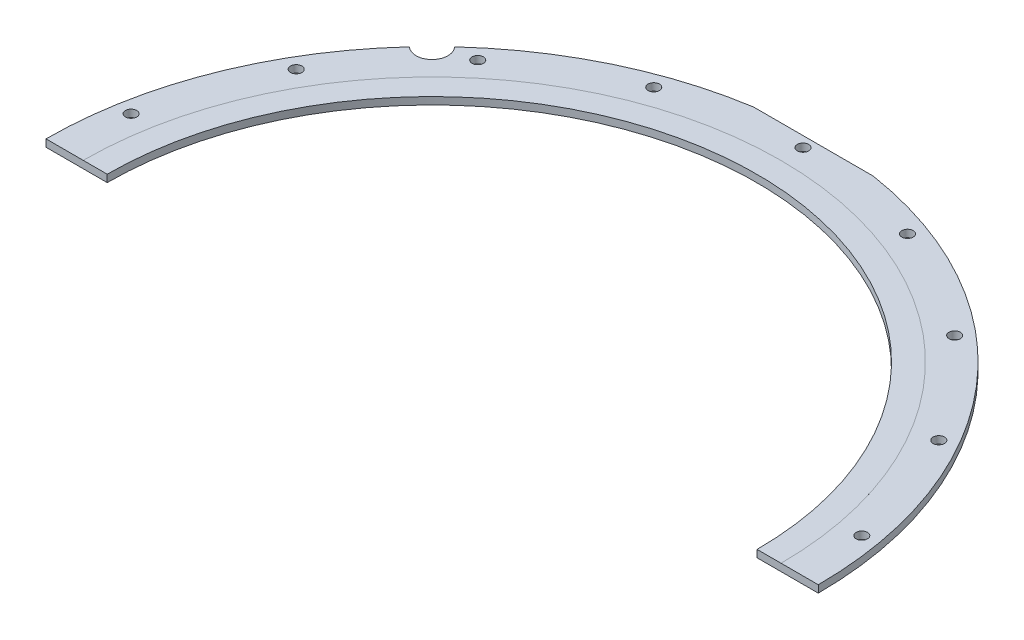
ISO-10303-21;
HEADER;
FILE_DESCRIPTION(('STEP AP214'),'2;1');
FILE_NAME('part.step','',(''),(''),'','','');
FILE_SCHEMA(('AUTOMOTIVE_DESIGN { 1 0 10303 214 1 1 1 1 }'));
ENDSEC;
DATA;
#1=APPLICATION_CONTEXT('core data for automotive mechanical design processes');
#2=APPLICATION_PROTOCOL_DEFINITION('international standard','automotive_design',2000,#1);
#3=PRODUCT_CONTEXT('',#1,'mechanical');
#4=PRODUCT('Part','Part','',(#3));
#5=PRODUCT_RELATED_PRODUCT_CATEGORY('part','',(#4));
#6=PRODUCT_DEFINITION_FORMATION('','',#4);
#7=PRODUCT_DEFINITION_CONTEXT('part definition',#1,'design');
#8=PRODUCT_DEFINITION('design','',#6,#7);
#9=PRODUCT_DEFINITION_SHAPE('','',#8);
#10=(LENGTH_UNIT() NAMED_UNIT(*) SI_UNIT(.MILLI.,.METRE.));
#11=(NAMED_UNIT(*) PLANE_ANGLE_UNIT() SI_UNIT($,.RADIAN.));
#12=(NAMED_UNIT(*) SI_UNIT($,.STERADIAN.) SOLID_ANGLE_UNIT());
#13=UNCERTAINTY_MEASURE_WITH_UNIT(LENGTH_MEASURE(1.E-05),#10,'distance_accuracy_value','');
#14=(GEOMETRIC_REPRESENTATION_CONTEXT(3) GLOBAL_UNCERTAINTY_ASSIGNED_CONTEXT((#13)) GLOBAL_UNIT_ASSIGNED_CONTEXT((#10,
#11,#12)) REPRESENTATION_CONTEXT('',''));
#15=CARTESIAN_POINT('',(0.,0.,0.));
#16=DIRECTION('',(0.,0.,1.));
#17=DIRECTION('',(1.,0.,0.));
#18=AXIS2_PLACEMENT_3D('',#15,#16,#17);
#19=CARTESIAN_POINT('',(0.,2.8956,0.));
#20=DIRECTION('',(0.,-1.,0.));
#21=DIRECTION('',(0.,0.,-1.));
#22=AXIS2_PLACEMENT_3D('',#19,#20,#21);
#23=CYLINDRICAL_SURFACE('',#22,153.);
#24=CARTESIAN_POINT('',(0.,2.8956,0.));
#25=DIRECTION('',(0.,1.,0.));
#26=DIRECTION('',(0.,0.,1.));
#27=AXIS2_PLACEMENT_3D('',#24,#25,#26);
#28=CIRCLE('',#27,153.);
#29=CARTESIAN_POINT('',(-23.657015872675,2.8956,-151.16));
#30=VERTEX_POINT('',#29);
#31=CARTESIAN_POINT('',(-103.641793125522,2.8956,-112.549450099619));
#32=VERTEX_POINT('',#31);
#33=EDGE_CURVE('E116',#30,#32,#28,.T.);
#34=ORIENTED_EDGE('',*,*,#33,.F.);
#35=DIRECTION('',(0.,-1.,0.));
#36=VECTOR('',#35,1.);
#37=CARTESIAN_POINT('',(-23.657015872675,2.8956,-151.16));
#38=LINE('',#37,#36);
#39=CARTESIAN_POINT('',(-23.6570158726749,0.,-151.16));
#40=VERTEX_POINT('',#39);
#41=EDGE_CURVE('E110',#30,#40,#38,.T.);
#42=ORIENTED_EDGE('',*,*,#41,.T.);
#43=CARTESIAN_POINT('',(0.,0.,0.));
#44=DIRECTION('',(0.,1.,0.));
#45=DIRECTION('',(0.,0.,1.));
#46=AXIS2_PLACEMENT_3D('',#43,#44,#45);
#47=CIRCLE('',#46,153.);
#48=CARTESIAN_POINT('',(-103.641793125522,0.,-112.549450099619));
#49=VERTEX_POINT('',#48);
#50=EDGE_CURVE('E56',#40,#49,#47,.T.);
#51=ORIENTED_EDGE('',*,*,#50,.T.);
#52=DIRECTION('',(0.,-1.,0.));
#53=VECTOR('',#52,1.);
#54=CARTESIAN_POINT('',(-103.641793125522,11.9427999999962,-112.549450099618));
#55=LINE('',#54,#53);
#56=EDGE_CURVE('E242',#49,#32,#55,.F.);
#57=ORIENTED_EDGE('',*,*,#56,.T.);
#58=EDGE_LOOP('',(#34,#42,#51,#57));
#59=FACE_BOUND('',#58,.T.);
#60=ADVANCED_FACE('F34',(#59),#23,.T.);
#61=CARTESIAN_POINT('',(152.999991830065,0.,-0.0500000000000054));
#62=VERTEX_POINT('',#61);
#63=CARTESIAN_POINT('',(23.657015872675,0.,-151.16));
#64=VERTEX_POINT('',#63);
#65=EDGE_CURVE('E122',#62,#64,#47,.T.);
#66=ORIENTED_EDGE('',*,*,#65,.T.);
#67=DIRECTION('',(0.,-1.,0.));
#68=VECTOR('',#67,1.);
#69=CARTESIAN_POINT('',(23.657015872675,2.8956,-151.16));
#70=LINE('',#69,#68);
#71=CARTESIAN_POINT('',(23.657015872675,2.8956,-151.16));
#72=VERTEX_POINT('',#71);
#73=EDGE_CURVE('E49',#64,#72,#70,.F.);
#74=ORIENTED_EDGE('',*,*,#73,.T.);
#75=CARTESIAN_POINT('',(152.999991830065,2.8956,-0.0500000000000054));
#76=VERTEX_POINT('',#75);
#77=EDGE_CURVE('E203',#76,#72,#28,.T.);
#78=ORIENTED_EDGE('',*,*,#77,.F.);
#79=DIRECTION('',(0.,-1.,0.));
#80=VECTOR('',#79,1.);
#81=CARTESIAN_POINT('',(152.999991830065,2.8956,-0.0500000000000054));
#82=LINE('',#81,#80);
#83=EDGE_CURVE('E139',#76,#62,#82,.T.);
#84=ORIENTED_EDGE('',*,*,#83,.T.);
#85=EDGE_LOOP('',(#66,#74,#78,#84));
#86=FACE_BOUND('',#85,.T.);
#87=ADVANCED_FACE('F216',(#86),#23,.T.);
#88=CARTESIAN_POINT('',(0.,2.8956,0.));
#89=DIRECTION('',(0.,-1.,0.));
#90=DIRECTION('',(0.,0.,-1.));
#91=AXIS2_PLACEMENT_3D('',#88,#89,#90);
#92=CYLINDRICAL_SURFACE('',#91,128.75);
#93=CARTESIAN_POINT('',(0.,0.,0.));
#94=DIRECTION('',(0.,-1.,0.));
#95=DIRECTION('',(0.,0.,1.));
#96=AXIS2_PLACEMENT_3D('',#93,#94,#95);
#97=CIRCLE('',#96,128.75);
#98=CARTESIAN_POINT('',(-128.749990291262,0.,-0.0499999999999997));
#99=VERTEX_POINT('',#98);
#100=CARTESIAN_POINT('',(128.749990291262,0.,-0.0499999999999997));
#101=VERTEX_POINT('',#100);
#102=EDGE_CURVE('E200',#99,#101,#97,.T.);
#103=ORIENTED_EDGE('',*,*,#102,.T.);
#104=DIRECTION('',(0.,-1.,0.));
#105=VECTOR('',#104,1.);
#106=CARTESIAN_POINT('',(128.749990291262,2.8956,-0.0499999999999997));
#107=LINE('',#106,#105);
#108=CARTESIAN_POINT('',(128.749990291262,2.8966,-0.0499999999999997));
#109=VERTEX_POINT('',#108);
#110=EDGE_CURVE('E42',#109,#101,#107,.T.);
#111=ORIENTED_EDGE('',*,*,#110,.F.);
#112=CARTESIAN_POINT('',(0.,2.8966,0.));
#113=DIRECTION('',(0.,-1.,0.));
#114=DIRECTION('',(0.,0.,1.));
#115=AXIS2_PLACEMENT_3D('',#112,#113,#114);
#116=CIRCLE('',#115,128.75);
#117=CARTESIAN_POINT('',(-128.749990291262,2.8966,-0.0500000000000848));
#118=VERTEX_POINT('',#117);
#119=EDGE_CURVE('E187',#118,#109,#116,.T.);
#120=ORIENTED_EDGE('',*,*,#119,.F.);
#121=DIRECTION('',(0.,-1.,0.));
#122=VECTOR('',#121,1.);
#123=CARTESIAN_POINT('',(-128.749990291262,2.8956,-0.0499999999999997));
#124=LINE('',#123,#122);
#125=EDGE_CURVE('E132',#118,#99,#124,.T.);
#126=ORIENTED_EDGE('',*,*,#125,.T.);
#127=EDGE_LOOP('',(#103,#111,#120,#126));
#128=FACE_BOUND('',#127,.T.);
#129=ADVANCED_FACE('F36',(#128),#92,.F.);
#130=CARTESIAN_POINT('',(128.749990291262,2.8956,-0.0499999999999997));
#131=DIRECTION('',(0.,0.,-1.));
#132=DIRECTION('',(-1.,0.,0.));
#133=AXIS2_PLACEMENT_3D('',#130,#131,#132);
#134=PLANE('',#133);
#135=DIRECTION('',(1.,0.,0.));
#136=VECTOR('',#135,1.);
#137=CARTESIAN_POINT('',(128.749990291262,0.,-0.0499999999999997));
#138=LINE('',#137,#136);
#139=EDGE_CURVE('E126',#101,#62,#138,.T.);
#140=ORIENTED_EDGE('',*,*,#139,.T.);
#141=ORIENTED_EDGE('',*,*,#83,.F.);
#142=DIRECTION('',(1.,0.,0.));
#143=VECTOR('',#142,1.);
#144=CARTESIAN_POINT('',(128.749990291262,2.8956,-0.0499999999999997));
#145=LINE('',#144,#143);
#146=CARTESIAN_POINT('',(138.249990958408,2.8956,-0.0499999999999997));
#147=VERTEX_POINT('',#146);
#148=EDGE_CURVE('E131',#147,#76,#145,.T.);
#149=ORIENTED_EDGE('',*,*,#148,.F.);
#150=DIRECTION('',(0.,-1.,0.));
#151=VECTOR('',#150,1.);
#152=CARTESIAN_POINT('',(138.249990958408,2.8966,-0.0500000000000019));
#153=LINE('',#152,#151);
#154=CARTESIAN_POINT('',(138.249990958408,2.8966,-0.0500000000000019));
#155=VERTEX_POINT('',#154);
#156=EDGE_CURVE('E192',#155,#147,#153,.T.);
#157=ORIENTED_EDGE('',*,*,#156,.F.);
#158=DIRECTION('',(1.,0.,0.));
#159=VECTOR('',#158,1.);
#160=CARTESIAN_POINT('',(128.749990291262,2.8966,-0.0499999999999997));
#161=LINE('',#160,#159);
#162=EDGE_CURVE('E190',#109,#155,#161,.T.);
#163=ORIENTED_EDGE('',*,*,#162,.F.);
#164=ORIENTED_EDGE('',*,*,#110,.T.);
#165=EDGE_LOOP('',(#140,#141,#149,#157,#163,#164));
#166=FACE_BOUND('',#165,.T.);
#167=ADVANCED_FACE('F211',(#166),#134,.F.);
#168=CARTESIAN_POINT('',(-112.549450099618,2.8956,-103.641793125522));
#169=VERTEX_POINT('',#168);
#170=CARTESIAN_POINT('',(-152.999991830065,2.8956,-0.0499999999999997));
#171=VERTEX_POINT('',#170);
#172=EDGE_CURVE('E202',#169,#171,#28,.T.);
#173=ORIENTED_EDGE('',*,*,#172,.F.);
#174=DIRECTION('',(0.,-1.,0.));
#175=VECTOR('',#174,1.);
#176=CARTESIAN_POINT('',(-112.549450099618,11.9427999999962,-103.641793125522));
#177=LINE('',#176,#175);
#178=CARTESIAN_POINT('',(-112.549450099618,0.,-103.641793125522));
#179=VERTEX_POINT('',#178);
#180=EDGE_CURVE('E238',#169,#179,#177,.T.);
#181=ORIENTED_EDGE('',*,*,#180,.T.);
#182=CARTESIAN_POINT('',(-152.999991830065,0.,-0.0499999999999997));
#183=VERTEX_POINT('',#182);
#184=EDGE_CURVE('E123',#179,#183,#47,.T.);
#185=ORIENTED_EDGE('',*,*,#184,.T.);
#186=DIRECTION('',(0.,-1.,0.));
#187=VECTOR('',#186,1.);
#188=CARTESIAN_POINT('',(-152.999991830065,2.8956,-0.0499999999999997));
#189=LINE('',#188,#187);
#190=EDGE_CURVE('E135',#171,#183,#189,.T.);
#191=ORIENTED_EDGE('',*,*,#190,.F.);
#192=EDGE_LOOP('',(#173,#181,#185,#191));
#193=FACE_BOUND('',#192,.T.);
#194=ADVANCED_FACE('F236',(#193),#23,.T.);
#195=CARTESIAN_POINT('',(-152.999991830065,2.8956,-0.0499999999999997));
#196=DIRECTION('',(0.,0.,-1.));
#197=DIRECTION('',(-1.,0.,0.));
#198=AXIS2_PLACEMENT_3D('',#195,#196,#197);
#199=PLANE('',#198);
#200=DIRECTION('',(1.,0.,0.));
#201=VECTOR('',#200,1.);
#202=CARTESIAN_POINT('',(-152.999991830065,0.,-0.0499999999999997));
#203=LINE('',#202,#201);
#204=EDGE_CURVE('E125',#183,#99,#203,.T.);
#205=ORIENTED_EDGE('',*,*,#204,.T.);
#206=ORIENTED_EDGE('',*,*,#125,.F.);
#207=DIRECTION('',(1.,0.,0.));
#208=VECTOR('',#207,1.);
#209=CARTESIAN_POINT('',(-138.249990958408,2.8966,-0.0500000000000119));
#210=LINE('',#209,#208);
#211=CARTESIAN_POINT('',(-138.249990958408,2.8966,-0.0500000000000119));
#212=VERTEX_POINT('',#211);
#213=EDGE_CURVE('E184',#212,#118,#210,.T.);
#214=ORIENTED_EDGE('',*,*,#213,.F.);
#215=DIRECTION('',(0.,-1.,0.));
#216=VECTOR('',#215,1.);
#217=CARTESIAN_POINT('',(-138.249990958408,2.8966,-0.0500000000000119));
#218=LINE('',#217,#216);
#219=CARTESIAN_POINT('',(-138.249990958408,2.8956,-0.0500000000000119));
#220=VERTEX_POINT('',#219);
#221=EDGE_CURVE('E197',#212,#220,#218,.T.);
#222=ORIENTED_EDGE('',*,*,#221,.T.);
#223=DIRECTION('',(1.,0.,0.));
#224=VECTOR('',#223,1.);
#225=CARTESIAN_POINT('',(-152.999991830065,2.8956,-0.0499999999999997));
#226=LINE('',#225,#224);
#227=EDGE_CURVE('E136',#171,#220,#226,.T.);
#228=ORIENTED_EDGE('',*,*,#227,.F.);
#229=ORIENTED_EDGE('',*,*,#190,.T.);
#230=EDGE_LOOP('',(#205,#206,#214,#222,#228,#229));
#231=FACE_BOUND('',#230,.T.);
#232=ADVANCED_FACE('F231',(#231),#199,.F.);
#233=CARTESIAN_POINT('',(0.,2.8956,0.));
#234=DIRECTION('',(0.,1.,0.));
#235=DIRECTION('',(0.,0.,1.));
#236=AXIS2_PLACEMENT_3D('',#233,#234,#235);
#237=PLANE('',#236);
#238=DIRECTION('',(1.,0.,0.));
#239=VECTOR('',#238,1.);
#240=CARTESIAN_POINT('',(0.,2.8956,-151.16));
#241=LINE('',#240,#239);
#242=EDGE_CURVE('E220',#30,#72,#241,.T.);
#243=ORIENTED_EDGE('',*,*,#242,.F.);
#244=ORIENTED_EDGE('',*,*,#33,.T.);
#245=CARTESIAN_POINT('',(-108.187337521542,2.8956,-108.187337521542));
#246=DIRECTION('',(0.,1.,0.));
#247=DIRECTION('',(0.,0.,1.));
#248=AXIS2_PLACEMENT_3D('',#245,#246,#247);
#249=CIRCLE('',#248,6.3);
#250=EDGE_CURVE('E243',#169,#32,#249,.T.);
#251=ORIENTED_EDGE('',*,*,#250,.F.);
#252=ORIENTED_EDGE('',*,*,#172,.T.);
#253=ORIENTED_EDGE('',*,*,#227,.T.);
#254=CARTESIAN_POINT('',(0.,2.8956,0.));
#255=DIRECTION('',(0.,1.,0.));
#256=DIRECTION('',(0.,0.,1.));
#257=AXIS2_PLACEMENT_3D('',#254,#255,#256);
#258=CIRCLE('',#257,138.25);
#259=EDGE_CURVE('E147',#147,#220,#258,.T.);
#260=ORIENTED_EDGE('',*,*,#259,.F.);
#261=ORIENTED_EDGE('',*,*,#148,.T.);
#262=ORIENTED_EDGE('',*,*,#77,.T.);
#263=EDGE_LOOP('',(#243,#244,#251,#252,#253,#260,#261,#262));
#264=FACE_BOUND('',#263,.T.);
#265=CARTESIAN_POINT('',(-94.4897786239215,2.8956,-112.60853313849));
#266=DIRECTION('',(0.,1.,0.));
#267=DIRECTION('',(0.642787609686541,0.,0.766044443118977));
#268=AXIS2_PLACEMENT_3D('',#265,#266,#267);
#269=CIRCLE('',#268,2.25);
#270=CARTESIAN_POINT('',(-93.0435065021268,2.8956,-110.884933141472));
#271=VERTEX_POINT('',#270);
#272=EDGE_CURVE('E262',#271,#271,#269,.T.);
#273=ORIENTED_EDGE('',*,*,#272,.F.);
#274=EDGE_LOOP('',(#273));
#275=FACE_BOUND('',#274,.T.);
#276=CARTESIAN_POINT('',(-127.305734356313,2.8956,-73.4999999999997));
#277=DIRECTION('',(0.,1.,0.));
#278=DIRECTION('',(0.86602540378444,0.,0.499999999999998));
#279=AXIS2_PLACEMENT_3D('',#276,#277,#278);
#280=CIRCLE('',#279,2.25);
#281=CARTESIAN_POINT('',(-125.357177197798,2.8956,-72.3749999999997));
#282=VERTEX_POINT('',#281);
#283=EDGE_CURVE('E265',#282,#282,#280,.T.);
#284=ORIENTED_EDGE('',*,*,#283,.F.);
#285=EDGE_LOOP('',(#284));
#286=FACE_BOUND('',#285,.T.);
#287=CARTESIAN_POINT('',(-144.766739692795,2.8956,-25.5262821170383));
#288=DIRECTION('',(0.,1.,0.));
#289=DIRECTION('',(0.984807753012209,0.,0.173648177666927));
#290=AXIS2_PLACEMENT_3D('',#287,#288,#289);
#291=CIRCLE('',#290,2.25);
#292=CARTESIAN_POINT('',(-142.550922248517,2.8956,-25.1355737172877));
#293=VERTEX_POINT('',#292);
#294=EDGE_CURVE('E253',#293,#293,#291,.T.);
#295=ORIENTED_EDGE('',*,*,#294,.F.);
#296=EDGE_LOOP('',(#295));
#297=FACE_BOUND('',#296,.T.);
#298=CARTESIAN_POINT('',(144.766739692794,2.8956,-25.5262821170402));
#299=DIRECTION('',(0.,1.,0.));
#300=DIRECTION('',(-0.984807753012206,0.,0.17364817766694));
#301=AXIS2_PLACEMENT_3D('',#298,#299,#300);
#302=CIRCLE('',#301,2.25);
#303=CARTESIAN_POINT('',(142.550922248517,2.8956,-25.1355737172896));
#304=VERTEX_POINT('',#303);
#305=EDGE_CURVE('E250',#304,#304,#302,.T.);
#306=ORIENTED_EDGE('',*,*,#305,.F.);
#307=EDGE_LOOP('',(#306));
#308=FACE_BOUND('',#307,.T.);
#309=CARTESIAN_POINT('',(127.305734356312,2.8956,-73.5000000000015));
#310=DIRECTION('',(0.,1.,0.));
#311=DIRECTION('',(-0.866025403784433,0.,0.50000000000001));
#312=AXIS2_PLACEMENT_3D('',#309,#310,#311);
#313=CIRCLE('',#312,2.25);
#314=CARTESIAN_POINT('',(125.357177197797,2.8956,-72.3750000000014));
#315=VERTEX_POINT('',#314);
#316=EDGE_CURVE('E254',#315,#315,#313,.T.);
#317=ORIENTED_EDGE('',*,*,#316,.F.);
#318=EDGE_LOOP('',(#317));
#319=FACE_BOUND('',#318,.T.);
#320=CARTESIAN_POINT('',(94.4897786239199,2.8956,-112.608533138491));
#321=DIRECTION('',(0.,1.,0.));
#322=DIRECTION('',(-0.64278760968653,0.,0.766044443118986));
#323=AXIS2_PLACEMENT_3D('',#320,#321,#322);
#324=CIRCLE('',#323,2.25);
#325=CARTESIAN_POINT('',(93.0435065021252,2.8956,-110.884933141473));
#326=VERTEX_POINT('',#325);
#327=EDGE_CURVE('E257',#326,#326,#324,.T.);
#328=ORIENTED_EDGE('',*,*,#327,.F.);
#329=EDGE_LOOP('',(#328));
#330=FACE_BOUND('',#329,.T.);
#331=CARTESIAN_POINT('',(50.2769610688716,2.8956,-138.134815255529));
#332=DIRECTION('',(0.,1.,0.));
#333=DIRECTION('',(-0.342020143325657,0.,0.939692620785913));
#334=AXIS2_PLACEMENT_3D('',#331,#332,#333);
#335=CIRCLE('',#334,2.25);
#336=CARTESIAN_POINT('',(49.5074157463888,2.8956,-136.020506858761));
#337=VERTEX_POINT('',#336);
#338=EDGE_CURVE('E245',#337,#337,#335,.T.);
#339=ORIENTED_EDGE('',*,*,#338,.F.);
#340=EDGE_LOOP('',(#339));
#341=FACE_BOUND('',#340,.T.);
#342=CARTESIAN_POINT('',(-50.2769610688734,2.8956,-138.134815255528));
#343=DIRECTION('',(0.,1.,0.));
#344=DIRECTION('',(0.342020143325669,0.,0.939692620785908));
#345=AXIS2_PLACEMENT_3D('',#342,#343,#344);
#346=CIRCLE('',#345,2.25);
#347=CARTESIAN_POINT('',(-49.5074157463906,2.8956,-136.02050685876));
#348=VERTEX_POINT('',#347);
#349=EDGE_CURVE('E153',#348,#348,#346,.T.);
#350=ORIENTED_EDGE('',*,*,#349,.F.);
#351=EDGE_LOOP('',(#350));
#352=FACE_BOUND('',#351,.T.);
#353=CARTESIAN_POINT('',(0.,2.8956,-147.));
#354=DIRECTION('',(0.,1.,0.));
#355=DIRECTION('',(0.,0.,1.));
#356=AXIS2_PLACEMENT_3D('',#353,#354,#355);
#357=CIRCLE('',#356,2.25);
#358=CARTESIAN_POINT('',(0.,2.8956,-144.75));
#359=VERTEX_POINT('',#358);
#360=EDGE_CURVE('E148',#359,#359,#357,.T.);
#361=ORIENTED_EDGE('',*,*,#360,.F.);
#362=EDGE_LOOP('',(#361));
#363=FACE_BOUND('',#362,.T.);
#364=ADVANCED_FACE('F218',(#264,#275,#286,#297,#308,#319,#330,#341,#352,#363),#237,.T.);
#365=CARTESIAN_POINT('',(0.,0.,0.));
#366=DIRECTION('',(0.,1.,0.));
#367=DIRECTION('',(0.,0.,1.));
#368=AXIS2_PLACEMENT_3D('',#365,#366,#367);
#369=PLANE('',#368);
#370=CARTESIAN_POINT('',(-94.4897786239215,0.,-112.60853313849));
#371=DIRECTION('',(0.,1.,0.));
#372=DIRECTION('',(0.,0.,1.));
#373=AXIS2_PLACEMENT_3D('',#370,#371,#372);
#374=CIRCLE('',#373,2.25);
#375=CARTESIAN_POINT('',(-94.4897786239215,0.,-110.35853313849));
#376=VERTEX_POINT('',#375);
#377=EDGE_CURVE('E170',#376,#376,#374,.T.);
#378=ORIENTED_EDGE('',*,*,#377,.T.);
#379=EDGE_LOOP('',(#378));
#380=FACE_BOUND('',#379,.T.);
#381=CARTESIAN_POINT('',(-127.305734356313,0.,-73.4999999999997));
#382=DIRECTION('',(0.,1.,0.));
#383=DIRECTION('',(0.,0.,1.));
#384=AXIS2_PLACEMENT_3D('',#381,#382,#383);
#385=CIRCLE('',#384,2.25);
#386=CARTESIAN_POINT('',(-127.305734356313,0.,-71.2499999999997));
#387=VERTEX_POINT('',#386);
#388=EDGE_CURVE('E168',#387,#387,#385,.T.);
#389=ORIENTED_EDGE('',*,*,#388,.T.);
#390=EDGE_LOOP('',(#389));
#391=FACE_BOUND('',#390,.T.);
#392=CARTESIAN_POINT('',(-144.766739692795,0.,-25.5262821170383));
#393=DIRECTION('',(0.,1.,0.));
#394=DIRECTION('',(0.,0.,1.));
#395=AXIS2_PLACEMENT_3D('',#392,#393,#394);
#396=CIRCLE('',#395,2.25);
#397=CARTESIAN_POINT('',(-144.766739692795,0.,-23.2762821170383));
#398=VERTEX_POINT('',#397);
#399=EDGE_CURVE('E165',#398,#398,#396,.T.);
#400=ORIENTED_EDGE('',*,*,#399,.T.);
#401=EDGE_LOOP('',(#400));
#402=FACE_BOUND('',#401,.T.);
#403=CARTESIAN_POINT('',(144.766739692794,0.,-25.5262821170402));
#404=DIRECTION('',(0.,1.,0.));
#405=DIRECTION('',(0.,0.,1.));
#406=AXIS2_PLACEMENT_3D('',#403,#404,#405);
#407=CIRCLE('',#406,2.25);
#408=CARTESIAN_POINT('',(144.766739692794,0.,-23.2762821170402));
#409=VERTEX_POINT('',#408);
#410=EDGE_CURVE('E162',#409,#409,#407,.T.);
#411=ORIENTED_EDGE('',*,*,#410,.T.);
#412=EDGE_LOOP('',(#411));
#413=FACE_BOUND('',#412,.T.);
#414=CARTESIAN_POINT('',(127.305734356312,0.,-73.5000000000015));
#415=DIRECTION('',(0.,1.,0.));
#416=DIRECTION('',(0.,0.,1.));
#417=AXIS2_PLACEMENT_3D('',#414,#415,#416);
#418=CIRCLE('',#417,2.25);
#419=CARTESIAN_POINT('',(127.305734356312,0.,-71.2500000000015));
#420=VERTEX_POINT('',#419);
#421=EDGE_CURVE('E159',#420,#420,#418,.T.);
#422=ORIENTED_EDGE('',*,*,#421,.T.);
#423=EDGE_LOOP('',(#422));
#424=FACE_BOUND('',#423,.T.);
#425=CARTESIAN_POINT('',(94.4897786239199,0.,-112.608533138491));
#426=DIRECTION('',(0.,1.,0.));
#427=DIRECTION('',(0.,0.,1.));
#428=AXIS2_PLACEMENT_3D('',#425,#426,#427);
#429=CIRCLE('',#428,2.25);
#430=CARTESIAN_POINT('',(94.4897786239199,0.,-110.358533138491));
#431=VERTEX_POINT('',#430);
#432=EDGE_CURVE('E156',#431,#431,#429,.T.);
#433=ORIENTED_EDGE('',*,*,#432,.T.);
#434=EDGE_LOOP('',(#433));
#435=FACE_BOUND('',#434,.T.);
#436=CARTESIAN_POINT('',(50.2769610688716,0.,-138.134815255529));
#437=DIRECTION('',(0.,1.,0.));
#438=DIRECTION('',(0.,0.,1.));
#439=AXIS2_PLACEMENT_3D('',#436,#437,#438);
#440=CIRCLE('',#439,2.25);
#441=CARTESIAN_POINT('',(50.2769610688716,0.,-135.884815255529));
#442=VERTEX_POINT('',#441);
#443=EDGE_CURVE('E152',#442,#442,#440,.T.);
#444=ORIENTED_EDGE('',*,*,#443,.T.);
#445=EDGE_LOOP('',(#444));
#446=FACE_BOUND('',#445,.T.);
#447=CARTESIAN_POINT('',(-50.2769610688734,0.,-138.134815255528));
#448=DIRECTION('',(0.,1.,0.));
#449=DIRECTION('',(0.,0.,1.));
#450=AXIS2_PLACEMENT_3D('',#447,#448,#449);
#451=CIRCLE('',#450,2.25);
#452=CARTESIAN_POINT('',(-50.2769610688734,0.,-135.884815255528));
#453=VERTEX_POINT('',#452);
#454=EDGE_CURVE('E149',#453,#453,#451,.T.);
#455=ORIENTED_EDGE('',*,*,#454,.T.);
#456=EDGE_LOOP('',(#455));
#457=FACE_BOUND('',#456,.T.);
#458=CARTESIAN_POINT('',(0.,0.,-147.));
#459=DIRECTION('',(0.,1.,0.));
#460=DIRECTION('',(0.,0.,1.));
#461=AXIS2_PLACEMENT_3D('',#458,#459,#460);
#462=CIRCLE('',#461,2.25);
#463=CARTESIAN_POINT('',(0.,0.,-144.75));
#464=VERTEX_POINT('',#463);
#465=EDGE_CURVE('E144',#464,#464,#462,.T.);
#466=ORIENTED_EDGE('',*,*,#465,.T.);
#467=EDGE_LOOP('',(#466));
#468=FACE_BOUND('',#467,.T.);
#469=ORIENTED_EDGE('',*,*,#50,.F.);
#470=DIRECTION('',(1.,0.,0.));
#471=VECTOR('',#470,1.);
#472=CARTESIAN_POINT('',(0.,0.,-151.16));
#473=LINE('',#472,#471);
#474=EDGE_CURVE('E11',#40,#64,#473,.T.);
#475=ORIENTED_EDGE('',*,*,#474,.T.);
#476=ORIENTED_EDGE('',*,*,#65,.F.);
#477=ORIENTED_EDGE('',*,*,#139,.F.);
#478=ORIENTED_EDGE('',*,*,#102,.F.);
#479=ORIENTED_EDGE('',*,*,#204,.F.);
#480=ORIENTED_EDGE('',*,*,#184,.F.);
#481=CARTESIAN_POINT('',(-108.187337521542,0.,-108.187337521542));
#482=DIRECTION('',(0.,-1.,0.));
#483=DIRECTION('',(0.,0.,-1.));
#484=AXIS2_PLACEMENT_3D('',#481,#482,#483);
#485=CIRCLE('',#484,6.3);
#486=EDGE_CURVE('E117',#49,#179,#485,.T.);
#487=ORIENTED_EDGE('',*,*,#486,.F.);
#488=EDGE_LOOP('',(#469,#475,#476,#477,#478,#479,#480,#487));
#489=FACE_BOUND('',#488,.T.);
#490=ADVANCED_FACE('F120',(#380,#391,#402,#413,#424,#435,#446,#457,#468,#489),#369,.F.);
#491=CARTESIAN_POINT('',(0.,2.8966,0.));
#492=DIRECTION('',(0.,-1.,0.));
#493=DIRECTION('',(0.,0.,-1.));
#494=AXIS2_PLACEMENT_3D('',#491,#492,#493);
#495=CYLINDRICAL_SURFACE('',#494,138.25);
#496=ORIENTED_EDGE('',*,*,#259,.T.);
#497=ORIENTED_EDGE('',*,*,#221,.F.);
#498=CARTESIAN_POINT('',(0.,2.8966,0.));
#499=DIRECTION('',(0.,1.,0.));
#500=DIRECTION('',(0.,0.,1.));
#501=AXIS2_PLACEMENT_3D('',#498,#499,#500);
#502=CIRCLE('',#501,138.25);
#503=EDGE_CURVE('E181',#155,#212,#502,.T.);
#504=ORIENTED_EDGE('',*,*,#503,.F.);
#505=ORIENTED_EDGE('',*,*,#156,.T.);
#506=EDGE_LOOP('',(#496,#497,#504,#505));
#507=FACE_BOUND('',#506,.T.);
#508=ADVANCED_FACE('F224',(#507),#495,.T.);
#509=CARTESIAN_POINT('',(0.,2.8966,0.));
#510=DIRECTION('',(0.,1.,0.));
#511=DIRECTION('',(0.,0.,1.));
#512=AXIS2_PLACEMENT_3D('',#509,#510,#511);
#513=PLANE('',#512);
#514=ORIENTED_EDGE('',*,*,#503,.T.);
#515=ORIENTED_EDGE('',*,*,#213,.T.);
#516=ORIENTED_EDGE('',*,*,#119,.T.);
#517=ORIENTED_EDGE('',*,*,#162,.T.);
#518=EDGE_LOOP('',(#514,#515,#516,#517));
#519=FACE_BOUND('',#518,.T.);
#520=ADVANCED_FACE('F227',(#519),#513,.T.);
#521=CARTESIAN_POINT('',(0.,-7.1044,-147.));
#522=DIRECTION('',(0.,1.,0.));
#523=DIRECTION('',(0.,0.,1.));
#524=AXIS2_PLACEMENT_3D('',#521,#522,#523);
#525=CYLINDRICAL_SURFACE('',#524,2.25);
#526=ORIENTED_EDGE('',*,*,#360,.T.);
#527=EDGE_LOOP('',(#526));
#528=FACE_BOUND('',#527,.T.);
#529=ORIENTED_EDGE('',*,*,#465,.F.);
#530=EDGE_LOOP('',(#529));
#531=FACE_BOUND('',#530,.T.);
#532=ADVANCED_FACE('F292',(#528,#531),#525,.F.);
#533=CARTESIAN_POINT('',(-50.2769610688734,-7.1044,-138.134815255528));
#534=DIRECTION('',(0.,1.,0.));
#535=DIRECTION('',(0.,0.,1.));
#536=AXIS2_PLACEMENT_3D('',#533,#534,#535);
#537=CYLINDRICAL_SURFACE('',#536,2.25);
#538=ORIENTED_EDGE('',*,*,#349,.T.);
#539=EDGE_LOOP('',(#538));
#540=FACE_BOUND('',#539,.T.);
#541=ORIENTED_EDGE('',*,*,#454,.F.);
#542=EDGE_LOOP('',(#541));
#543=FACE_BOUND('',#542,.T.);
#544=ADVANCED_FACE('F288',(#540,#543),#537,.F.);
#545=CARTESIAN_POINT('',(50.2769610688716,-7.1044,-138.134815255529));
#546=DIRECTION('',(0.,1.,0.));
#547=DIRECTION('',(0.,0.,1.));
#548=AXIS2_PLACEMENT_3D('',#545,#546,#547);
#549=CYLINDRICAL_SURFACE('',#548,2.25);
#550=ORIENTED_EDGE('',*,*,#338,.T.);
#551=EDGE_LOOP('',(#550));
#552=FACE_BOUND('',#551,.T.);
#553=ORIENTED_EDGE('',*,*,#443,.F.);
#554=EDGE_LOOP('',(#553));
#555=FACE_BOUND('',#554,.T.);
#556=ADVANCED_FACE('F291',(#552,#555),#549,.F.);
#557=CARTESIAN_POINT('',(94.4897786239199,-7.1044,-112.608533138491));
#558=DIRECTION('',(0.,1.,0.));
#559=DIRECTION('',(0.,0.,1.));
#560=AXIS2_PLACEMENT_3D('',#557,#558,#559);
#561=CYLINDRICAL_SURFACE('',#560,2.25);
#562=ORIENTED_EDGE('',*,*,#327,.T.);
#563=EDGE_LOOP('',(#562));
#564=FACE_BOUND('',#563,.T.);
#565=ORIENTED_EDGE('',*,*,#432,.F.);
#566=EDGE_LOOP('',(#565));
#567=FACE_BOUND('',#566,.T.);
#568=ADVANCED_FACE('F397',(#564,#567),#561,.F.);
#569=CARTESIAN_POINT('',(127.305734356312,-7.1044,-73.5000000000015));
#570=DIRECTION('',(0.,1.,0.));
#571=DIRECTION('',(0.,0.,1.));
#572=AXIS2_PLACEMENT_3D('',#569,#570,#571);
#573=CYLINDRICAL_SURFACE('',#572,2.25);
#574=ORIENTED_EDGE('',*,*,#316,.T.);
#575=EDGE_LOOP('',(#574));
#576=FACE_BOUND('',#575,.T.);
#577=ORIENTED_EDGE('',*,*,#421,.F.);
#578=EDGE_LOOP('',(#577));
#579=FACE_BOUND('',#578,.T.);
#580=ADVANCED_FACE('F389',(#576,#579),#573,.F.);
#581=CARTESIAN_POINT('',(144.766739692794,-7.1044,-25.5262821170402));
#582=DIRECTION('',(0.,1.,0.));
#583=DIRECTION('',(0.,0.,1.));
#584=AXIS2_PLACEMENT_3D('',#581,#582,#583);
#585=CYLINDRICAL_SURFACE('',#584,2.25);
#586=ORIENTED_EDGE('',*,*,#305,.T.);
#587=EDGE_LOOP('',(#586));
#588=FACE_BOUND('',#587,.T.);
#589=ORIENTED_EDGE('',*,*,#410,.F.);
#590=EDGE_LOOP('',(#589));
#591=FACE_BOUND('',#590,.T.);
#592=ADVANCED_FACE('F382',(#588,#591),#585,.F.);
#593=CARTESIAN_POINT('',(-144.766739692795,-7.1044,-25.5262821170383));
#594=DIRECTION('',(0.,1.,0.));
#595=DIRECTION('',(0.,0.,1.));
#596=AXIS2_PLACEMENT_3D('',#593,#594,#595);
#597=CYLINDRICAL_SURFACE('',#596,2.25);
#598=ORIENTED_EDGE('',*,*,#294,.T.);
#599=EDGE_LOOP('',(#598));
#600=FACE_BOUND('',#599,.T.);
#601=ORIENTED_EDGE('',*,*,#399,.F.);
#602=EDGE_LOOP('',(#601));
#603=FACE_BOUND('',#602,.T.);
#604=ADVANCED_FACE('F270',(#600,#603),#597,.F.);
#605=CARTESIAN_POINT('',(-127.305734356313,-7.1044,-73.4999999999997));
#606=DIRECTION('',(0.,1.,0.));
#607=DIRECTION('',(0.,0.,1.));
#608=AXIS2_PLACEMENT_3D('',#605,#606,#607);
#609=CYLINDRICAL_SURFACE('',#608,2.25);
#610=ORIENTED_EDGE('',*,*,#283,.T.);
#611=EDGE_LOOP('',(#610));
#612=FACE_BOUND('',#611,.T.);
#613=ORIENTED_EDGE('',*,*,#388,.F.);
#614=EDGE_LOOP('',(#613));
#615=FACE_BOUND('',#614,.T.);
#616=ADVANCED_FACE('F368',(#612,#615),#609,.F.);
#617=CARTESIAN_POINT('',(-94.4897786239215,-7.1044,-112.60853313849));
#618=DIRECTION('',(0.,1.,0.));
#619=DIRECTION('',(0.,0.,1.));
#620=AXIS2_PLACEMENT_3D('',#617,#618,#619);
#621=CYLINDRICAL_SURFACE('',#620,2.25);
#622=ORIENTED_EDGE('',*,*,#272,.T.);
#623=EDGE_LOOP('',(#622));
#624=FACE_BOUND('',#623,.T.);
#625=ORIENTED_EDGE('',*,*,#377,.F.);
#626=EDGE_LOOP('',(#625));
#627=FACE_BOUND('',#626,.T.);
#628=ADVANCED_FACE('F362',(#624,#627),#621,.F.);
#629=CARTESIAN_POINT('',(-108.187337521542,23.8855999999923,-108.187337521542));
#630=DIRECTION('',(0.,-1.,0.));
#631=DIRECTION('',(0.,0.,-1.));
#632=AXIS2_PLACEMENT_3D('',#629,#630,#631);
#633=CYLINDRICAL_SURFACE('',#632,6.3);
#634=ORIENTED_EDGE('',*,*,#486,.T.);
#635=ORIENTED_EDGE('',*,*,#180,.F.);
#636=ORIENTED_EDGE('',*,*,#250,.T.);
#637=ORIENTED_EDGE('',*,*,#56,.F.);
#638=EDGE_LOOP('',(#634,#635,#636,#637));
#639=FACE_BOUND('',#638,.T.);
#640=ADVANCED_FACE('F354',(#639),#633,.F.);
#641=CARTESIAN_POINT('',(45.,10.,-151.16));
#642=DIRECTION('',(0.,0.,1.));
#643=DIRECTION('',(1.,0.,0.));
#644=AXIS2_PLACEMENT_3D('',#641,#642,#643);
#645=PLANE('',#644);
#646=ORIENTED_EDGE('',*,*,#242,.T.);
#647=ORIENTED_EDGE('',*,*,#73,.F.);
#648=ORIENTED_EDGE('',*,*,#474,.F.);
#649=ORIENTED_EDGE('',*,*,#41,.F.);
#650=EDGE_LOOP('',(#646,#647,#648,#649));
#651=FACE_BOUND('',#650,.T.);
#652=ADVANCED_FACE('F109',(#651),#645,.F.);
#653=CLOSED_SHELL('',(#60,#87,#129,#167,#194,#232,#364,#490,#508,#520,#532,#544,#556,#568,#580,
#592,#604,#616,#628,#640,#652));
#654=MANIFOLD_SOLID_BREP('B2',#653);
#655=ADVANCED_BREP_SHAPE_REPRESENTATION('',(#18,#654),#14);
#656=SHAPE_DEFINITION_REPRESENTATION(#9,#655);
ENDSEC;
END-ISO-10303-21;
